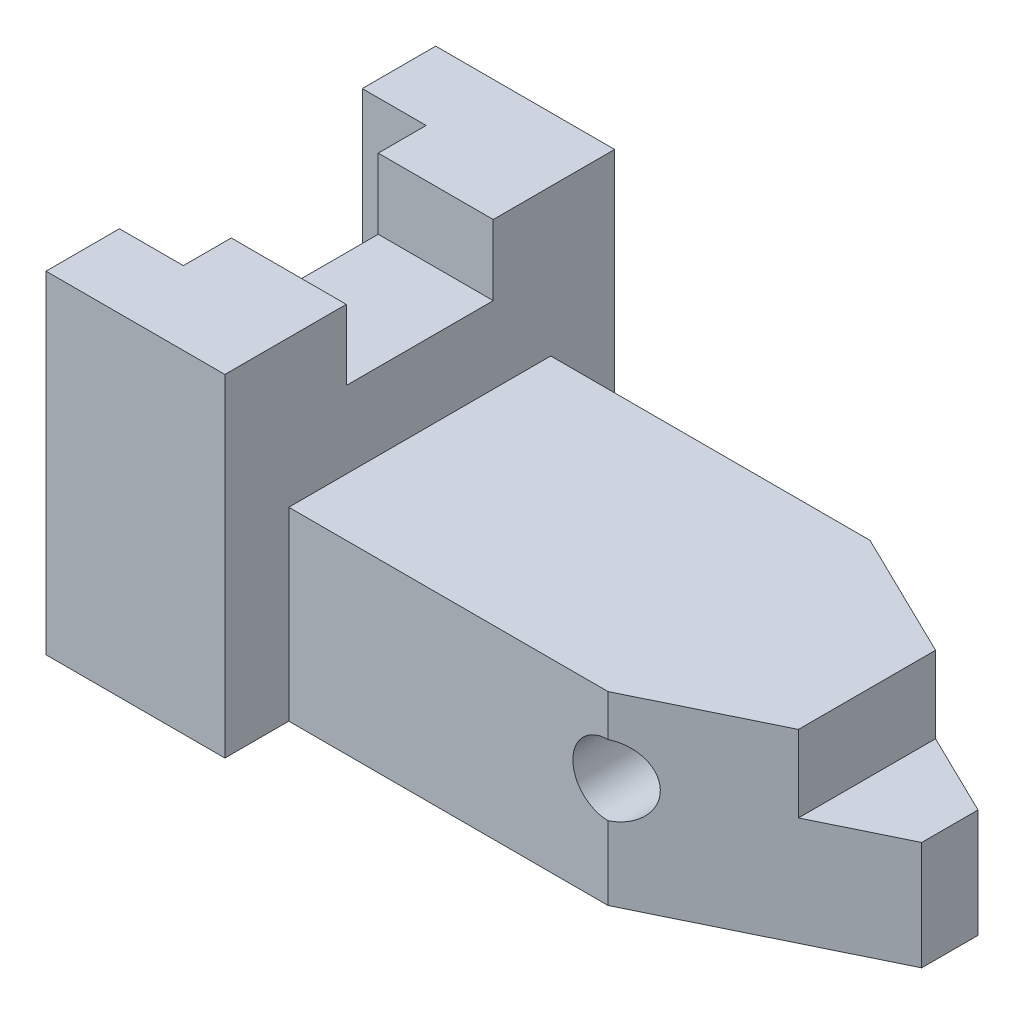
ISO-10303-21;
HEADER;
FILE_DESCRIPTION(('STEP AP214'),'2;1');
FILE_NAME('part.step','',(''),(''),'','','');
FILE_SCHEMA(('AUTOMOTIVE_DESIGN { 1 0 10303 214 1 1 1 1 }'));
ENDSEC;
DATA;
#1=APPLICATION_CONTEXT('core data for automotive mechanical design processes');
#2=APPLICATION_PROTOCOL_DEFINITION('international standard','automotive_design',2000,#1);
#3=PRODUCT_CONTEXT('',#1,'mechanical');
#4=PRODUCT('Part','Part','',(#3));
#5=PRODUCT_RELATED_PRODUCT_CATEGORY('part','',(#4));
#6=PRODUCT_DEFINITION_FORMATION('','',#4);
#7=PRODUCT_DEFINITION_CONTEXT('part definition',#1,'design');
#8=PRODUCT_DEFINITION('design','',#6,#7);
#9=PRODUCT_DEFINITION_SHAPE('','',#8);
#10=(LENGTH_UNIT() NAMED_UNIT(*) SI_UNIT(.MILLI.,.METRE.));
#11=(NAMED_UNIT(*) PLANE_ANGLE_UNIT() SI_UNIT($,.RADIAN.));
#12=(NAMED_UNIT(*) SI_UNIT($,.STERADIAN.) SOLID_ANGLE_UNIT());
#13=UNCERTAINTY_MEASURE_WITH_UNIT(LENGTH_MEASURE(1.E-05),#10,'distance_accuracy_value','');
#14=(GEOMETRIC_REPRESENTATION_CONTEXT(3) GLOBAL_UNCERTAINTY_ASSIGNED_CONTEXT((#13)) GLOBAL_UNIT_ASSIGNED_CONTEXT((#10,
#11,#12)) REPRESENTATION_CONTEXT('',''));
#15=CARTESIAN_POINT('',(0.,0.,0.));
#16=DIRECTION('',(0.,0.,1.));
#17=DIRECTION('',(1.,0.,0.));
#18=AXIS2_PLACEMENT_3D('',#15,#16,#17);
#19=CARTESIAN_POINT('',(0.,1320.8,0.));
#20=DIRECTION('',(0.,1.,0.));
#21=DIRECTION('',(0.,0.,1.));
#22=AXIS2_PLACEMENT_3D('',#19,#20,#21);
#23=PLANE('',#22);
#24=DIRECTION('',(0.,0.,1.));
#25=VECTOR('',#24,1.);
#26=CARTESIAN_POINT('',(254.,1320.8,-2.41352831440252E-13));
#27=LINE('',#26,#25);
#28=CARTESIAN_POINT('',(254.,1320.8,-482.6));
#29=VERTEX_POINT('',#28);
#30=CARTESIAN_POINT('',(254.,1320.8,-292.1));
#31=VERTEX_POINT('',#30);
#32=EDGE_CURVE('E270',#29,#31,#27,.T.);
#33=ORIENTED_EDGE('',*,*,#32,.T.);
#34=DIRECTION('',(1.,0.,0.));
#35=VECTOR('',#34,1.);
#36=CARTESIAN_POINT('',(-25.4000000000001,1320.8,-292.1));
#37=LINE('',#36,#35);
#38=CARTESIAN_POINT('',(711.2,1320.8,-292.1));
#39=VERTEX_POINT('',#38);
#40=EDGE_CURVE('E304',#31,#39,#37,.T.);
#41=ORIENTED_EDGE('',*,*,#40,.T.);
#42=DIRECTION('',(0.,0.,1.));
#43=VECTOR('',#42,1.);
#44=CARTESIAN_POINT('',(711.2,1320.8,0.));
#45=LINE('',#44,#43);
#46=CARTESIAN_POINT('',(711.2,1320.8,-774.7));
#47=VERTEX_POINT('',#46);
#48=EDGE_CURVE('E275',#47,#39,#45,.T.);
#49=ORIENTED_EDGE('',*,*,#48,.F.);
#50=DIRECTION('',(-1.,0.,0.));
#51=VECTOR('',#50,1.);
#52=CARTESIAN_POINT('',(-1.20935008039526E-13,1320.8,-774.7));
#53=LINE('',#52,#51);
#54=CARTESIAN_POINT('',(0.,1320.8,-774.7));
#55=VERTEX_POINT('',#54);
#56=EDGE_CURVE('E274',#47,#55,#53,.T.);
#57=ORIENTED_EDGE('',*,*,#56,.T.);
#58=DIRECTION('',(0.,0.,1.));
#59=VECTOR('',#58,1.);
#60=CARTESIAN_POINT('',(1.60216026965096E-13,1320.8,0.));
#61=LINE('',#60,#59);
#62=CARTESIAN_POINT('',(0.,1320.8,-482.6));
#63=VERTEX_POINT('',#62);
#64=EDGE_CURVE('E280',#55,#63,#61,.T.);
#65=ORIENTED_EDGE('',*,*,#64,.T.);
#66=DIRECTION('',(1.,0.,0.));
#67=VECTOR('',#66,1.);
#68=CARTESIAN_POINT('',(-1.0547118733939E-13,1320.8,-482.6));
#69=LINE('',#68,#67);
#70=EDGE_CURVE('E276',#63,#29,#69,.T.);
#71=ORIENTED_EDGE('',*,*,#70,.T.);
#72=EDGE_LOOP('',(#33,#41,#49,#57,#65,#71));
#73=FACE_BOUND('',#72,.T.);
#74=ADVANCED_FACE('F43',(#73),#23,.T.);
#75=CARTESIAN_POINT('',(254.,1320.8,-2.41352831440252E-13));
#76=DIRECTION('',(1.,0.,0.));
#77=DIRECTION('',(0.,0.,-1.));
#78=AXIS2_PLACEMENT_3D('',#75,#76,#77);
#79=PLANE('',#78);
#80=CARTESIAN_POINT('',(254.,1320.8,292.1));
#81=VERTEX_POINT('',#80);
#82=CARTESIAN_POINT('',(254.,1320.8,482.6));
#83=VERTEX_POINT('',#82);
#84=EDGE_CURVE('E271',#81,#83,#27,.T.);
#85=ORIENTED_EDGE('',*,*,#84,.F.);
#86=DIRECTION('',(0.,-1.,0.));
#87=VECTOR('',#86,1.);
#88=CARTESIAN_POINT('',(254.000000000001,1320.8,292.1));
#89=LINE('',#88,#87);
#90=CARTESIAN_POINT('',(254.,1041.4,292.1));
#91=VERTEX_POINT('',#90);
#92=EDGE_CURVE('E351',#81,#91,#89,.T.);
#93=ORIENTED_EDGE('',*,*,#92,.T.);
#94=DIRECTION('',(0.,0.,-1.));
#95=VECTOR('',#94,1.);
#96=CARTESIAN_POINT('',(254.,1041.4,-2.41352831440252E-13));
#97=LINE('',#96,#95);
#98=CARTESIAN_POINT('',(254.,1041.4,-292.1));
#99=VERTEX_POINT('',#98);
#100=EDGE_CURVE('E352',#91,#99,#97,.T.);
#101=ORIENTED_EDGE('',*,*,#100,.T.);
#102=DIRECTION('',(0.,1.,0.));
#103=VECTOR('',#102,1.);
#104=CARTESIAN_POINT('',(254.,1320.8,-292.1));
#105=LINE('',#104,#103);
#106=EDGE_CURVE('E350',#99,#31,#105,.T.);
#107=ORIENTED_EDGE('',*,*,#106,.T.);
#108=ORIENTED_EDGE('',*,*,#32,.F.);
#109=DIRECTION('',(0.,-1.,0.));
#110=VECTOR('',#109,1.);
#111=CARTESIAN_POINT('',(254.,1320.8,-482.6));
#112=LINE('',#111,#110);
#113=CARTESIAN_POINT('',(254.,0.,-482.6));
#114=VERTEX_POINT('',#113);
#115=EDGE_CURVE('E284',#29,#114,#112,.T.);
#116=ORIENTED_EDGE('',*,*,#115,.T.);
#117=DIRECTION('',(0.,0.,1.));
#118=VECTOR('',#117,1.);
#119=CARTESIAN_POINT('',(254.,0.,-2.41352831440252E-13));
#120=LINE('',#119,#118);
#121=CARTESIAN_POINT('',(254.,0.,482.6));
#122=VERTEX_POINT('',#121);
#123=EDGE_CURVE('E266',#114,#122,#120,.T.);
#124=ORIENTED_EDGE('',*,*,#123,.T.);
#125=DIRECTION('',(0.,-1.,0.));
#126=VECTOR('',#125,1.);
#127=CARTESIAN_POINT('',(254.,1320.8,482.6));
#128=LINE('',#127,#126);
#129=EDGE_CURVE('E238',#83,#122,#128,.T.);
#130=ORIENTED_EDGE('',*,*,#129,.F.);
#131=EDGE_LOOP('',(#85,#93,#101,#107,#108,#116,#124,#130));
#132=FACE_BOUND('',#131,.T.);
#133=ADVANCED_FACE('F44',(#132),#79,.F.);
#134=CARTESIAN_POINT('',(711.2,1320.8,0.));
#135=DIRECTION('',(1.,0.,0.));
#136=DIRECTION('',(0.,0.,-1.));
#137=AXIS2_PLACEMENT_3D('',#134,#135,#136);
#138=PLANE('',#137);
#139=DIRECTION('',(0.,-1.,0.));
#140=VECTOR('',#139,1.);
#141=CARTESIAN_POINT('',(711.2,1320.8,292.1));
#142=LINE('',#141,#140);
#143=CARTESIAN_POINT('',(711.2,1320.8,292.1));
#144=VERTEX_POINT('',#143);
#145=CARTESIAN_POINT('',(711.2,1041.4,292.1));
#146=VERTEX_POINT('',#145);
#147=EDGE_CURVE('E331',#144,#146,#142,.T.);
#148=ORIENTED_EDGE('',*,*,#147,.F.);
#149=CARTESIAN_POINT('',(711.2,1320.8,774.7));
#150=VERTEX_POINT('',#149);
#151=EDGE_CURVE('E269',#144,#150,#45,.T.);
#152=ORIENTED_EDGE('',*,*,#151,.T.);
#153=DIRECTION('',(0.,-1.,0.));
#154=VECTOR('',#153,1.);
#155=CARTESIAN_POINT('',(711.2,1320.8,774.7));
#156=LINE('',#155,#154);
#157=CARTESIAN_POINT('',(711.2,0.,774.7));
#158=VERTEX_POINT('',#157);
#159=EDGE_CURVE('E221',#150,#158,#156,.T.);
#160=ORIENTED_EDGE('',*,*,#159,.T.);
#161=DIRECTION('',(0.,0.,-1.));
#162=VECTOR('',#161,1.);
#163=CARTESIAN_POINT('',(711.2,0.,0.));
#164=LINE('',#163,#162);
#165=CARTESIAN_POINT('',(711.2,0.,520.7));
#166=VERTEX_POINT('',#165);
#167=EDGE_CURVE('E217',#158,#166,#164,.T.);
#168=ORIENTED_EDGE('',*,*,#167,.T.);
#169=DIRECTION('',(0.,-1.,0.));
#170=VECTOR('',#169,1.);
#171=CARTESIAN_POINT('',(711.2,736.6,520.7));
#172=LINE('',#171,#170);
#173=CARTESIAN_POINT('',(711.2,736.6,520.7));
#174=VERTEX_POINT('',#173);
#175=EDGE_CURVE('E206',#174,#166,#172,.T.);
#176=ORIENTED_EDGE('',*,*,#175,.F.);
#177=DIRECTION('',(0.,0.,1.));
#178=VECTOR('',#177,1.);
#179=CARTESIAN_POINT('',(711.2,736.6,0.));
#180=LINE('',#179,#178);
#181=CARTESIAN_POINT('',(711.2,736.6,-520.7));
#182=VERTEX_POINT('',#181);
#183=EDGE_CURVE('E243',#182,#174,#180,.T.);
#184=ORIENTED_EDGE('',*,*,#183,.F.);
#185=DIRECTION('',(0.,-1.,0.));
#186=VECTOR('',#185,1.);
#187=CARTESIAN_POINT('',(711.2,736.6,-520.7));
#188=LINE('',#187,#186);
#189=CARTESIAN_POINT('',(711.2,0.,-520.7));
#190=VERTEX_POINT('',#189);
#191=EDGE_CURVE('E253',#182,#190,#188,.T.);
#192=ORIENTED_EDGE('',*,*,#191,.T.);
#193=DIRECTION('',(0.,0.,1.));
#194=VECTOR('',#193,1.);
#195=CARTESIAN_POINT('',(711.2,0.,0.));
#196=LINE('',#195,#194);
#197=CARTESIAN_POINT('',(711.2,0.,-774.7));
#198=VERTEX_POINT('',#197);
#199=EDGE_CURVE('E285',#198,#190,#196,.T.);
#200=ORIENTED_EDGE('',*,*,#199,.F.);
#201=DIRECTION('',(0.,-1.,0.));
#202=VECTOR('',#201,1.);
#203=CARTESIAN_POINT('',(711.2,1320.8,-774.7));
#204=LINE('',#203,#202);
#205=EDGE_CURVE('E297',#47,#198,#204,.T.);
#206=ORIENTED_EDGE('',*,*,#205,.F.);
#207=ORIENTED_EDGE('',*,*,#48,.T.);
#208=DIRECTION('',(0.,1.,0.));
#209=VECTOR('',#208,1.);
#210=CARTESIAN_POINT('',(711.2,1320.8,-292.1));
#211=LINE('',#210,#209);
#212=CARTESIAN_POINT('',(711.2,1041.4,-292.1));
#213=VERTEX_POINT('',#212);
#214=EDGE_CURVE('E338',#213,#39,#211,.T.);
#215=ORIENTED_EDGE('',*,*,#214,.F.);
#216=DIRECTION('',(0.,0.,-1.));
#217=VECTOR('',#216,1.);
#218=CARTESIAN_POINT('',(711.2,1041.4,292.1));
#219=LINE('',#218,#217);
#220=EDGE_CURVE('E339',#146,#213,#219,.T.);
#221=ORIENTED_EDGE('',*,*,#220,.F.);
#222=EDGE_LOOP('',(#148,#152,#160,#168,#176,#184,#192,#200,#206,#207,#215,#221));
#223=FACE_BOUND('',#222,.T.);
#224=ADVANCED_FACE('F373',(#223),#138,.T.);
#225=CARTESIAN_POINT('',(-1.20935008039526E-13,1320.8,-774.7));
#226=DIRECTION('',(0.,0.,1.));
#227=DIRECTION('',(1.,0.,0.));
#228=AXIS2_PLACEMENT_3D('',#225,#226,#227);
#229=PLANE('',#228);
#230=DIRECTION('',(-1.,0.,0.));
#231=VECTOR('',#230,1.);
#232=CARTESIAN_POINT('',(-1.20935008039526E-13,0.,-774.7));
#233=LINE('',#232,#231);
#234=CARTESIAN_POINT('',(0.,0.,-774.7));
#235=VERTEX_POINT('',#234);
#236=EDGE_CURVE('E288',#198,#235,#233,.T.);
#237=ORIENTED_EDGE('',*,*,#236,.T.);
#238=DIRECTION('',(0.,-1.,0.));
#239=VECTOR('',#238,1.);
#240=CARTESIAN_POINT('',(0.,1320.8,-774.7));
#241=LINE('',#240,#239);
#242=EDGE_CURVE('E296',#55,#235,#241,.T.);
#243=ORIENTED_EDGE('',*,*,#242,.F.);
#244=ORIENTED_EDGE('',*,*,#56,.F.);
#245=ORIENTED_EDGE('',*,*,#205,.T.);
#246=EDGE_LOOP('',(#237,#243,#244,#245));
#247=FACE_BOUND('',#246,.T.);
#248=ADVANCED_FACE('F406',(#247),#229,.F.);
#249=CARTESIAN_POINT('',(1.60216026965096E-13,1320.8,0.));
#250=DIRECTION('',(1.,0.,0.));
#251=DIRECTION('',(0.,0.,-1.));
#252=AXIS2_PLACEMENT_3D('',#249,#250,#251);
#253=PLANE('',#252);
#254=DIRECTION('',(0.,0.,1.));
#255=VECTOR('',#254,1.);
#256=CARTESIAN_POINT('',(1.60216026965096E-13,0.,0.));
#257=LINE('',#256,#255);
#258=CARTESIAN_POINT('',(0.,0.,-482.6));
#259=VERTEX_POINT('',#258);
#260=EDGE_CURVE('E286',#235,#259,#257,.T.);
#261=ORIENTED_EDGE('',*,*,#260,.T.);
#262=DIRECTION('',(0.,-1.,0.));
#263=VECTOR('',#262,1.);
#264=CARTESIAN_POINT('',(0.,1320.8,-482.6));
#265=LINE('',#264,#263);
#266=EDGE_CURVE('E294',#63,#259,#265,.T.);
#267=ORIENTED_EDGE('',*,*,#266,.F.);
#268=ORIENTED_EDGE('',*,*,#64,.F.);
#269=ORIENTED_EDGE('',*,*,#242,.T.);
#270=EDGE_LOOP('',(#261,#267,#268,#269));
#271=FACE_BOUND('',#270,.T.);
#272=ADVANCED_FACE('F405',(#271),#253,.F.);
#273=CARTESIAN_POINT('',(-1.0547118733939E-13,1320.8,-482.6));
#274=DIRECTION('',(0.,0.,-1.));
#275=DIRECTION('',(-1.,0.,0.));
#276=AXIS2_PLACEMENT_3D('',#273,#274,#275);
#277=PLANE('',#276);
#278=DIRECTION('',(1.,0.,0.));
#279=VECTOR('',#278,1.);
#280=CARTESIAN_POINT('',(-1.0547118733939E-13,0.,-482.6));
#281=LINE('',#280,#279);
#282=EDGE_CURVE('E287',#259,#114,#281,.T.);
#283=ORIENTED_EDGE('',*,*,#282,.T.);
#284=ORIENTED_EDGE('',*,*,#115,.F.);
#285=ORIENTED_EDGE('',*,*,#70,.F.);
#286=ORIENTED_EDGE('',*,*,#266,.T.);
#287=EDGE_LOOP('',(#283,#284,#285,#286));
#288=FACE_BOUND('',#287,.T.);
#289=ADVANCED_FACE('F398',(#288),#277,.F.);
#290=DIRECTION('',(1.,0.,0.));
#291=VECTOR('',#290,1.);
#292=CARTESIAN_POINT('',(-25.4000000000001,1320.8,292.1));
#293=LINE('',#292,#291);
#294=EDGE_CURVE('E305',#81,#144,#293,.T.);
#295=ORIENTED_EDGE('',*,*,#294,.F.);
#296=ORIENTED_EDGE('',*,*,#84,.T.);
#297=DIRECTION('',(1.,0.,0.));
#298=VECTOR('',#297,1.);
#299=CARTESIAN_POINT('',(-1.21594775571598E-13,1320.8,482.6));
#300=LINE('',#299,#298);
#301=CARTESIAN_POINT('',(0.,1320.8,482.6));
#302=VERTEX_POINT('',#301);
#303=EDGE_CURVE('E212',#302,#83,#300,.T.);
#304=ORIENTED_EDGE('',*,*,#303,.F.);
#305=DIRECTION('',(0.,0.,-1.));
#306=VECTOR('',#305,1.);
#307=CARTESIAN_POINT('',(1.60216026965096E-13,1320.8,0.));
#308=LINE('',#307,#306);
#309=CARTESIAN_POINT('',(0.,1320.8,774.7));
#310=VERTEX_POINT('',#309);
#311=EDGE_CURVE('E220',#310,#302,#308,.T.);
#312=ORIENTED_EDGE('',*,*,#311,.F.);
#313=DIRECTION('',(-1.,0.,0.));
#314=VECTOR('',#313,1.);
#315=CARTESIAN_POINT('',(-1.46817610201755E-13,1320.8,774.7));
#316=LINE('',#315,#314);
#317=EDGE_CURVE('E222',#150,#310,#316,.T.);
#318=ORIENTED_EDGE('',*,*,#317,.F.);
#319=ORIENTED_EDGE('',*,*,#151,.F.);
#320=EDGE_LOOP('',(#295,#296,#304,#312,#318,#319));
#321=FACE_BOUND('',#320,.T.);
#322=ADVANCED_FACE('F436',(#321),#23,.T.);
#323=CARTESIAN_POINT('',(0.,0.,0.));
#324=DIRECTION('',(0.,1.,0.));
#325=DIRECTION('',(0.,0.,1.));
#326=AXIS2_PLACEMENT_3D('',#323,#324,#325);
#327=PLANE('',#326);
#328=DIRECTION('',(0.,0.,1.));
#329=VECTOR('',#328,1.);
#330=CARTESIAN_POINT('',(2818.60678968964,0.,0.));
#331=LINE('',#330,#329);
#332=CARTESIAN_POINT('',(2818.60678968964,0.,-111.882544264101));
#333=VERTEX_POINT('',#332);
#334=CARTESIAN_POINT('',(2818.60678968964,0.,111.882544264102));
#335=VERTEX_POINT('',#334);
#336=EDGE_CURVE('E245',#333,#335,#331,.T.);
#337=ORIENTED_EDGE('',*,*,#336,.T.);
#338=DIRECTION('',(-0.89879404629917,0.,0.438371146789072));
#339=VECTOR('',#338,1.);
#340=CARTESIAN_POINT('',(585.731911603682,0.,1200.92838849663));
#341=LINE('',#340,#339);
#342=CARTESIAN_POINT('',(1980.40678968964,0.,520.7));
#343=VERTEX_POINT('',#342);
#344=EDGE_CURVE('E363',#335,#343,#341,.T.);
#345=ORIENTED_EDGE('',*,*,#344,.T.);
#346=DIRECTION('',(-1.,0.,0.));
#347=VECTOR('',#346,1.);
#348=CARTESIAN_POINT('',(0.,0.,520.7));
#349=LINE('',#348,#347);
#350=EDGE_CURVE('E356',#343,#166,#349,.T.);
#351=ORIENTED_EDGE('',*,*,#350,.T.);
#352=ORIENTED_EDGE('',*,*,#167,.F.);
#353=DIRECTION('',(-1.,0.,0.));
#354=VECTOR('',#353,1.);
#355=CARTESIAN_POINT('',(-1.46817610201755E-13,0.,774.7));
#356=LINE('',#355,#354);
#357=CARTESIAN_POINT('',(0.,0.,774.7));
#358=VERTEX_POINT('',#357);
#359=EDGE_CURVE('E227',#158,#358,#356,.T.);
#360=ORIENTED_EDGE('',*,*,#359,.T.);
#361=DIRECTION('',(0.,0.,-1.));
#362=VECTOR('',#361,1.);
#363=CARTESIAN_POINT('',(1.60216026965096E-13,0.,0.));
#364=LINE('',#363,#362);
#365=CARTESIAN_POINT('',(0.,0.,482.6));
#366=VERTEX_POINT('',#365);
#367=EDGE_CURVE('E226',#358,#366,#364,.T.);
#368=ORIENTED_EDGE('',*,*,#367,.T.);
#369=DIRECTION('',(1.,0.,0.));
#370=VECTOR('',#369,1.);
#371=CARTESIAN_POINT('',(-1.21594775571598E-13,0.,482.6));
#372=LINE('',#371,#370);
#373=EDGE_CURVE('E208',#366,#122,#372,.T.);
#374=ORIENTED_EDGE('',*,*,#373,.T.);
#375=ORIENTED_EDGE('',*,*,#123,.F.);
#376=ORIENTED_EDGE('',*,*,#282,.F.);
#377=ORIENTED_EDGE('',*,*,#260,.F.);
#378=ORIENTED_EDGE('',*,*,#236,.F.);
#379=ORIENTED_EDGE('',*,*,#199,.T.);
#380=DIRECTION('',(-1.,0.,0.));
#381=VECTOR('',#380,1.);
#382=CARTESIAN_POINT('',(0.,0.,-520.7));
#383=LINE('',#382,#381);
#384=CARTESIAN_POINT('',(1980.40678968964,0.,-520.7));
#385=VERTEX_POINT('',#384);
#386=EDGE_CURVE('E250',#385,#190,#383,.T.);
#387=ORIENTED_EDGE('',*,*,#386,.F.);
#388=DIRECTION('',(-0.89879404629917,0.,-0.438371146789072));
#389=VECTOR('',#388,1.);
#390=CARTESIAN_POINT('',(585.731911603682,0.,-1200.92838849663));
#391=LINE('',#390,#389);
#392=EDGE_CURVE('E255',#333,#385,#391,.T.);
#393=ORIENTED_EDGE('',*,*,#392,.F.);
#394=EDGE_LOOP('',(#337,#345,#351,#352,#360,#368,#374,#375,#376,#377,#378,#379,#387,#393));
#395=FACE_BOUND('',#394,.T.);
#396=ADVANCED_FACE('F368',(#395),#327,.F.);
#397=CARTESIAN_POINT('',(2818.60678968964,736.6,0.));
#398=DIRECTION('',(1.,0.,0.));
#399=DIRECTION('',(0.,0.,-1.));
#400=AXIS2_PLACEMENT_3D('',#397,#398,#399);
#401=PLANE('',#400);
#402=DIRECTION('',(0.,0.,-1.));
#403=VECTOR('',#402,1.);
#404=CARTESIAN_POINT('',(2818.60678968964,431.8,0.));
#405=LINE('',#404,#403);
#406=CARTESIAN_POINT('',(2818.60678968964,431.8,111.882544264102));
#407=VERTEX_POINT('',#406);
#408=CARTESIAN_POINT('',(2818.60678968964,431.8,-111.882544264101));
#409=VERTEX_POINT('',#408);
#410=EDGE_CURVE('E317',#407,#409,#405,.T.);
#411=ORIENTED_EDGE('',*,*,#410,.F.);
#412=DIRECTION('',(0.,-1.,0.));
#413=VECTOR('',#412,1.);
#414=CARTESIAN_POINT('',(2818.60678968964,736.6,111.882544264102));
#415=LINE('',#414,#413);
#416=EDGE_CURVE('E209',#407,#335,#415,.T.);
#417=ORIENTED_EDGE('',*,*,#416,.T.);
#418=ORIENTED_EDGE('',*,*,#336,.F.);
#419=DIRECTION('',(0.,-1.,0.));
#420=VECTOR('',#419,1.);
#421=CARTESIAN_POINT('',(2818.60678968964,736.6,-111.882544264101));
#422=LINE('',#421,#420);
#423=EDGE_CURVE('E262',#409,#333,#422,.T.);
#424=ORIENTED_EDGE('',*,*,#423,.F.);
#425=EDGE_LOOP('',(#411,#417,#418,#424));
#426=FACE_BOUND('',#425,.T.);
#427=ADVANCED_FACE('F323',(#426),#401,.T.);
#428=CARTESIAN_POINT('',(585.731911603682,736.6,-1200.92838849663));
#429=DIRECTION('',(-0.438371146789072,0.,0.89879404629917));
#430=DIRECTION('',(0.89879404629917,0.,0.438371146789072));
#431=AXIS2_PLACEMENT_3D('',#428,#429,#430);
#432=PLANE('',#431);
#433=DIRECTION('',(0.,-1.,0.));
#434=VECTOR('',#433,1.);
#435=CARTESIAN_POINT('',(1980.40678968964,736.6,-520.7));
#436=LINE('',#435,#434);
#437=CARTESIAN_POINT('',(1980.40678968964,292.1,-520.7));
#438=VERTEX_POINT('',#437);
#439=EDGE_CURVE('E257',#438,#385,#436,.T.);
#440=ORIENTED_EDGE('',*,*,#439,.F.);
#441=CARTESIAN_POINT('',(1980.40678968964,431.8,-520.7));
#442=DIRECTION('',(-0.438371146789072,0.,0.89879404629917));
#443=DIRECTION('',(0.89879404629917,0.,0.438371146789072));
#444=AXIS2_PLACEMENT_3D('',#441,#442,#443);
#445=ELLIPSE('',#444,155.430491084383,139.7);
#446=CARTESIAN_POINT('',(1980.40678968964,571.5,-520.7));
#447=VERTEX_POINT('',#446);
#448=EDGE_CURVE('E60',#438,#447,#445,.T.);
#449=ORIENTED_EDGE('',*,*,#448,.T.);
#450=CARTESIAN_POINT('',(1980.40678968964,736.6,-520.7));
#451=VERTEX_POINT('',#450);
#452=EDGE_CURVE('E261',#451,#447,#436,.T.);
#453=ORIENTED_EDGE('',*,*,#452,.F.);
#454=DIRECTION('',(-0.89879404629917,0.,-0.438371146789072));
#455=VECTOR('',#454,1.);
#456=CARTESIAN_POINT('',(585.731911603682,736.6,-1200.92838849663));
#457=LINE('',#456,#455);
#458=CARTESIAN_POINT('',(2489.2,736.6,-272.544970490599));
#459=VERTEX_POINT('',#458);
#460=EDGE_CURVE('E248',#459,#451,#457,.T.);
#461=ORIENTED_EDGE('',*,*,#460,.F.);
#462=DIRECTION('',(0.,-1.,0.));
#463=VECTOR('',#462,1.);
#464=CARTESIAN_POINT('',(2489.2,736.6,-272.544970490599));
#465=LINE('',#464,#463);
#466=CARTESIAN_POINT('',(2489.2,431.8,-272.544970490599));
#467=VERTEX_POINT('',#466);
#468=EDGE_CURVE('E335',#459,#467,#465,.T.);
#469=ORIENTED_EDGE('',*,*,#468,.T.);
#470=DIRECTION('',(0.89879404629917,0.,0.438371146789072));
#471=VECTOR('',#470,1.);
#472=CARTESIAN_POINT('',(585.731911603682,431.8,-1200.92838849663));
#473=LINE('',#472,#471);
#474=EDGE_CURVE('E324',#467,#409,#473,.T.);
#475=ORIENTED_EDGE('',*,*,#474,.T.);
#476=ORIENTED_EDGE('',*,*,#423,.T.);
#477=ORIENTED_EDGE('',*,*,#392,.T.);
#478=EDGE_LOOP('',(#440,#449,#453,#461,#469,#475,#476,#477));
#479=FACE_BOUND('',#478,.T.);
#480=ADVANCED_FACE('F417',(#479),#432,.F.);
#481=CARTESIAN_POINT('',(0.,736.6,-520.7));
#482=DIRECTION('',(0.,0.,1.));
#483=DIRECTION('',(1.,0.,0.));
#484=AXIS2_PLACEMENT_3D('',#481,#482,#483);
#485=PLANE('',#484);
#486=ORIENTED_EDGE('',*,*,#452,.T.);
#487=CARTESIAN_POINT('',(1980.40678968964,431.8,-520.7));
#488=DIRECTION('',(0.,0.,1.));
#489=DIRECTION('',(1.,0.,0.));
#490=AXIS2_PLACEMENT_3D('',#487,#488,#489);
#491=CIRCLE('',#490,139.7);
#492=EDGE_CURVE('E199',#447,#438,#491,.T.);
#493=ORIENTED_EDGE('',*,*,#492,.T.);
#494=ORIENTED_EDGE('',*,*,#439,.T.);
#495=ORIENTED_EDGE('',*,*,#386,.T.);
#496=ORIENTED_EDGE('',*,*,#191,.F.);
#497=DIRECTION('',(-1.,0.,0.));
#498=VECTOR('',#497,1.);
#499=CARTESIAN_POINT('',(0.,736.6,-520.7));
#500=LINE('',#499,#498);
#501=EDGE_CURVE('E249',#451,#182,#500,.T.);
#502=ORIENTED_EDGE('',*,*,#501,.F.);
#503=EDGE_LOOP('',(#486,#493,#494,#495,#496,#502));
#504=FACE_BOUND('',#503,.T.);
#505=ADVANCED_FACE('F411',(#504),#485,.F.);
#506=CARTESIAN_POINT('',(0.,736.6,0.));
#507=DIRECTION('',(0.,1.,0.));
#508=DIRECTION('',(0.,0.,1.));
#509=AXIS2_PLACEMENT_3D('',#506,#507,#508);
#510=PLANE('',#509);
#511=DIRECTION('',(0.,0.,1.));
#512=VECTOR('',#511,1.);
#513=CARTESIAN_POINT('',(2489.2,736.6,0.));
#514=LINE('',#513,#512);
#515=CARTESIAN_POINT('',(2489.2,736.6,272.544970490599));
#516=VERTEX_POINT('',#515);
#517=EDGE_CURVE('E311',#459,#516,#514,.T.);
#518=ORIENTED_EDGE('',*,*,#517,.F.);
#519=ORIENTED_EDGE('',*,*,#460,.T.);
#520=ORIENTED_EDGE('',*,*,#501,.T.);
#521=ORIENTED_EDGE('',*,*,#183,.T.);
#522=DIRECTION('',(-1.,0.,0.));
#523=VECTOR('',#522,1.);
#524=CARTESIAN_POINT('',(0.,736.6,520.7));
#525=LINE('',#524,#523);
#526=CARTESIAN_POINT('',(1980.40678968964,736.6,520.7));
#527=VERTEX_POINT('',#526);
#528=EDGE_CURVE('E359',#527,#174,#525,.T.);
#529=ORIENTED_EDGE('',*,*,#528,.F.);
#530=DIRECTION('',(-0.89879404629917,0.,0.438371146789072));
#531=VECTOR('',#530,1.);
#532=CARTESIAN_POINT('',(585.731911603682,736.6,1200.92838849663));
#533=LINE('',#532,#531);
#534=EDGE_CURVE('E202',#516,#527,#533,.T.);
#535=ORIENTED_EDGE('',*,*,#534,.F.);
#536=EDGE_LOOP('',(#518,#519,#520,#521,#529,#535));
#537=FACE_BOUND('',#536,.T.);
#538=ADVANCED_FACE('F423',(#537),#510,.T.);
#539=CARTESIAN_POINT('',(-1.21594775571598E-13,1320.8,482.6));
#540=DIRECTION('',(0.,0.,-1.));
#541=DIRECTION('',(-1.,0.,0.));
#542=AXIS2_PLACEMENT_3D('',#539,#540,#541);
#543=PLANE('',#542);
#544=ORIENTED_EDGE('',*,*,#373,.F.);
#545=DIRECTION('',(0.,-1.,0.));
#546=VECTOR('',#545,1.);
#547=CARTESIAN_POINT('',(0.,1320.8,482.6));
#548=LINE('',#547,#546);
#549=EDGE_CURVE('E236',#302,#366,#548,.T.);
#550=ORIENTED_EDGE('',*,*,#549,.F.);
#551=ORIENTED_EDGE('',*,*,#303,.T.);
#552=ORIENTED_EDGE('',*,*,#129,.T.);
#553=EDGE_LOOP('',(#544,#550,#551,#552));
#554=FACE_BOUND('',#553,.T.);
#555=ADVANCED_FACE('F390',(#554),#543,.T.);
#556=CARTESIAN_POINT('',(1.60216026965096E-13,1320.8,0.));
#557=DIRECTION('',(-1.,0.,0.));
#558=DIRECTION('',(0.,0.,1.));
#559=AXIS2_PLACEMENT_3D('',#556,#557,#558);
#560=PLANE('',#559);
#561=ORIENTED_EDGE('',*,*,#367,.F.);
#562=DIRECTION('',(0.,-1.,0.));
#563=VECTOR('',#562,1.);
#564=CARTESIAN_POINT('',(0.,1320.8,774.7));
#565=LINE('',#564,#563);
#566=EDGE_CURVE('E237',#310,#358,#565,.T.);
#567=ORIENTED_EDGE('',*,*,#566,.F.);
#568=ORIENTED_EDGE('',*,*,#311,.T.);
#569=ORIENTED_EDGE('',*,*,#549,.T.);
#570=EDGE_LOOP('',(#561,#567,#568,#569));
#571=FACE_BOUND('',#570,.T.);
#572=ADVANCED_FACE('F385',(#571),#560,.T.);
#573=CARTESIAN_POINT('',(-1.46817610201755E-13,1320.8,774.7));
#574=DIRECTION('',(0.,0.,1.));
#575=DIRECTION('',(1.,0.,0.));
#576=AXIS2_PLACEMENT_3D('',#573,#574,#575);
#577=PLANE('',#576);
#578=ORIENTED_EDGE('',*,*,#359,.F.);
#579=ORIENTED_EDGE('',*,*,#159,.F.);
#580=ORIENTED_EDGE('',*,*,#317,.T.);
#581=ORIENTED_EDGE('',*,*,#566,.T.);
#582=EDGE_LOOP('',(#578,#579,#580,#581));
#583=FACE_BOUND('',#582,.T.);
#584=ADVANCED_FACE('F380',(#583),#577,.T.);
#585=CARTESIAN_POINT('',(0.,736.6,520.7));
#586=DIRECTION('',(0.,0.,1.));
#587=DIRECTION('',(1.,0.,0.));
#588=AXIS2_PLACEMENT_3D('',#585,#586,#587);
#589=PLANE('',#588);
#590=CARTESIAN_POINT('',(1980.40678968964,431.8,520.7));
#591=DIRECTION('',(0.,0.,1.));
#592=DIRECTION('',(1.,0.,0.));
#593=AXIS2_PLACEMENT_3D('',#590,#591,#592);
#594=CIRCLE('',#593,139.7);
#595=CARTESIAN_POINT('',(1980.40678968964,571.5,520.7));
#596=VERTEX_POINT('',#595);
#597=CARTESIAN_POINT('',(1980.40678968964,292.1,520.7));
#598=VERTEX_POINT('',#597);
#599=EDGE_CURVE('E65',#596,#598,#594,.T.);
#600=ORIENTED_EDGE('',*,*,#599,.F.);
#601=DIRECTION('',(0.,-1.,0.));
#602=VECTOR('',#601,1.);
#603=CARTESIAN_POINT('',(1980.40678968964,736.6,520.7));
#604=LINE('',#603,#602);
#605=EDGE_CURVE('E198',#527,#596,#604,.T.);
#606=ORIENTED_EDGE('',*,*,#605,.F.);
#607=ORIENTED_EDGE('',*,*,#528,.T.);
#608=ORIENTED_EDGE('',*,*,#175,.T.);
#609=ORIENTED_EDGE('',*,*,#350,.F.);
#610=EDGE_CURVE('E200',#598,#343,#604,.T.);
#611=ORIENTED_EDGE('',*,*,#610,.F.);
#612=EDGE_LOOP('',(#600,#606,#607,#608,#609,#611));
#613=FACE_BOUND('',#612,.T.);
#614=ADVANCED_FACE('F194',(#613),#589,.T.);
#615=CARTESIAN_POINT('',(585.731911603682,736.6,1200.92838849663));
#616=DIRECTION('',(0.438371146789072,0.,0.89879404629917));
#617=DIRECTION('',(0.89879404629917,0.,-0.438371146789072));
#618=AXIS2_PLACEMENT_3D('',#615,#616,#617);
#619=PLANE('',#618);
#620=CARTESIAN_POINT('',(1980.40678968964,431.8,520.7));
#621=DIRECTION('',(0.438371146789072,0.,0.89879404629917));
#622=DIRECTION('',(-0.89879404629917,0.,0.438371146789072));
#623=AXIS2_PLACEMENT_3D('',#620,#621,#622);
#624=ELLIPSE('',#623,155.430491084383,139.7);
#625=EDGE_CURVE('E11',#598,#596,#624,.T.);
#626=ORIENTED_EDGE('',*,*,#625,.F.);
#627=ORIENTED_EDGE('',*,*,#610,.T.);
#628=ORIENTED_EDGE('',*,*,#344,.F.);
#629=ORIENTED_EDGE('',*,*,#416,.F.);
#630=DIRECTION('',(0.89879404629917,0.,-0.438371146789072));
#631=VECTOR('',#630,1.);
#632=CARTESIAN_POINT('',(585.731911603682,431.8,1200.92838849663));
#633=LINE('',#632,#631);
#634=CARTESIAN_POINT('',(2489.2,431.8,272.544970490599));
#635=VERTEX_POINT('',#634);
#636=EDGE_CURVE('E301',#635,#407,#633,.T.);
#637=ORIENTED_EDGE('',*,*,#636,.F.);
#638=DIRECTION('',(0.,-1.,0.));
#639=VECTOR('',#638,1.);
#640=CARTESIAN_POINT('',(2489.2,736.6,272.544970490599));
#641=LINE('',#640,#639);
#642=EDGE_CURVE('E51',#516,#635,#641,.T.);
#643=ORIENTED_EDGE('',*,*,#642,.F.);
#644=ORIENTED_EDGE('',*,*,#534,.T.);
#645=ORIENTED_EDGE('',*,*,#605,.T.);
#646=EDGE_LOOP('',(#626,#627,#628,#629,#637,#643,#644,#645));
#647=FACE_BOUND('',#646,.T.);
#648=ADVANCED_FACE('F205',(#647),#619,.T.);
#649=CARTESIAN_POINT('',(-25.4000000000001,1041.4,292.1));
#650=DIRECTION('',(0.,-1.,0.));
#651=DIRECTION('',(0.,0.,-1.));
#652=AXIS2_PLACEMENT_3D('',#649,#650,#651);
#653=PLANE('',#652);
#654=DIRECTION('',(1.,0.,0.));
#655=VECTOR('',#654,1.);
#656=CARTESIAN_POINT('',(-25.4000000000001,1041.4,292.1));
#657=LINE('',#656,#655);
#658=EDGE_CURVE('E343',#91,#146,#657,.T.);
#659=ORIENTED_EDGE('',*,*,#658,.T.);
#660=ORIENTED_EDGE('',*,*,#220,.T.);
#661=DIRECTION('',(1.,0.,0.));
#662=VECTOR('',#661,1.);
#663=CARTESIAN_POINT('',(-25.4000000000001,1041.4,-292.1));
#664=LINE('',#663,#662);
#665=EDGE_CURVE('E342',#99,#213,#664,.T.);
#666=ORIENTED_EDGE('',*,*,#665,.F.);
#667=ORIENTED_EDGE('',*,*,#100,.F.);
#668=EDGE_LOOP('',(#659,#660,#666,#667));
#669=FACE_BOUND('',#668,.T.);
#670=ADVANCED_FACE('F458',(#669),#653,.F.);
#671=CARTESIAN_POINT('',(-25.4000000000001,1320.8,292.1));
#672=DIRECTION('',(0.,0.,1.));
#673=DIRECTION('',(0.,-1.,0.));
#674=AXIS2_PLACEMENT_3D('',#671,#672,#673);
#675=PLANE('',#674);
#676=ORIENTED_EDGE('',*,*,#294,.T.);
#677=ORIENTED_EDGE('',*,*,#147,.T.);
#678=ORIENTED_EDGE('',*,*,#658,.F.);
#679=ORIENTED_EDGE('',*,*,#92,.F.);
#680=EDGE_LOOP('',(#676,#677,#678,#679));
#681=FACE_BOUND('',#680,.T.);
#682=ADVANCED_FACE('F452',(#681),#675,.F.);
#683=CARTESIAN_POINT('',(-25.4000000000001,1320.8,-292.1));
#684=DIRECTION('',(0.,0.,-1.));
#685=DIRECTION('',(0.,1.,0.));
#686=AXIS2_PLACEMENT_3D('',#683,#684,#685);
#687=PLANE('',#686);
#688=ORIENTED_EDGE('',*,*,#665,.T.);
#689=ORIENTED_EDGE('',*,*,#214,.T.);
#690=ORIENTED_EDGE('',*,*,#40,.F.);
#691=ORIENTED_EDGE('',*,*,#106,.F.);
#692=EDGE_LOOP('',(#688,#689,#690,#691));
#693=FACE_BOUND('',#692,.T.);
#694=ADVANCED_FACE('F461',(#693),#687,.F.);
#695=CARTESIAN_POINT('',(2489.2,1050.25608357213,-774.7));
#696=DIRECTION('',(-1.,0.,0.));
#697=DIRECTION('',(0.,0.,1.));
#698=AXIS2_PLACEMENT_3D('',#695,#696,#697);
#699=PLANE('',#698);
#700=ORIENTED_EDGE('',*,*,#517,.T.);
#701=ORIENTED_EDGE('',*,*,#642,.T.);
#702=DIRECTION('',(0.,0.,1.));
#703=VECTOR('',#702,1.);
#704=CARTESIAN_POINT('',(2489.2,431.8,-774.7));
#705=LINE('',#704,#703);
#706=EDGE_CURVE('E309',#467,#635,#705,.T.);
#707=ORIENTED_EDGE('',*,*,#706,.F.);
#708=ORIENTED_EDGE('',*,*,#468,.F.);
#709=EDGE_LOOP('',(#700,#701,#707,#708));
#710=FACE_BOUND('',#709,.T.);
#711=ADVANCED_FACE('F310',(#710),#699,.F.);
#712=CARTESIAN_POINT('',(2489.2,431.8,-774.7));
#713=DIRECTION('',(0.,-1.,0.));
#714=DIRECTION('',(0.,0.,-1.));
#715=AXIS2_PLACEMENT_3D('',#712,#713,#714);
#716=PLANE('',#715);
#717=ORIENTED_EDGE('',*,*,#706,.T.);
#718=ORIENTED_EDGE('',*,*,#636,.T.);
#719=ORIENTED_EDGE('',*,*,#410,.T.);
#720=ORIENTED_EDGE('',*,*,#474,.F.);
#721=EDGE_LOOP('',(#717,#718,#719,#720));
#722=FACE_BOUND('',#721,.T.);
#723=ADVANCED_FACE('F318',(#722),#716,.F.);
#724=CARTESIAN_POINT('',(1980.40678968964,431.8,-774.7));
#725=DIRECTION('',(0.,0.,1.));
#726=DIRECTION('',(1.,0.,0.));
#727=AXIS2_PLACEMENT_3D('',#724,#725,#726);
#728=CYLINDRICAL_SURFACE('',#727,139.7);
#729=ORIENTED_EDGE('',*,*,#625,.T.);
#730=ORIENTED_EDGE('',*,*,#599,.T.);
#731=EDGE_LOOP('',(#729,#730));
#732=FACE_BOUND('',#731,.T.);
#733=ORIENTED_EDGE('',*,*,#492,.F.);
#734=ORIENTED_EDGE('',*,*,#448,.F.);
#735=EDGE_LOOP('',(#733,#734));
#736=FACE_BOUND('',#735,.T.);
#737=ADVANCED_FACE('F190',(#732,#736),#728,.F.);
#738=CLOSED_SHELL('',(#74,#133,#224,#248,#272,#289,#322,#396,#427,#480,#505,#538,#555,#572,#584,
#614,#648,#670,#682,#694,#711,#723,#737));
#739=MANIFOLD_SOLID_BREP('B2',#738);
#740=ADVANCED_BREP_SHAPE_REPRESENTATION('',(#18,#739),#14);
#741=SHAPE_DEFINITION_REPRESENTATION(#9,#740);
ENDSEC;
END-ISO-10303-21;
